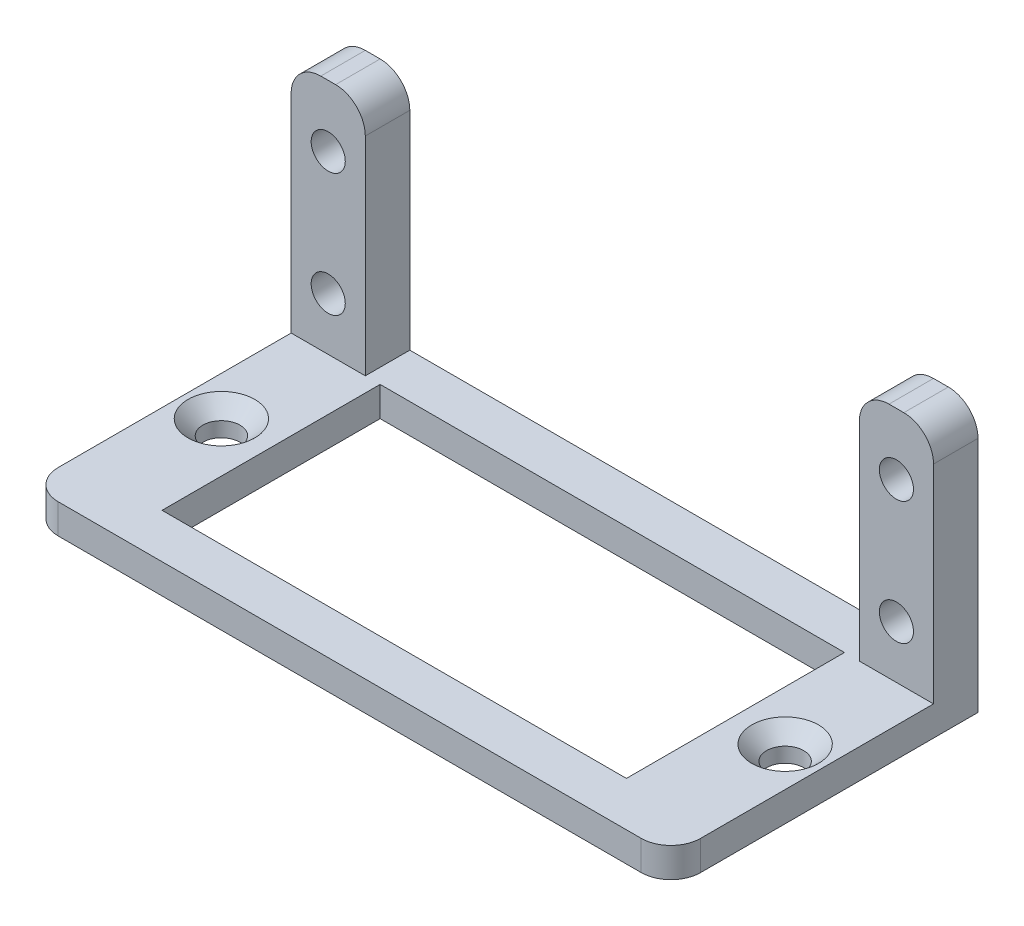
ISO-10303-21;
HEADER;
FILE_DESCRIPTION(('STEP AP214'),'2;1');
FILE_NAME('part.step','',(''),(''),'','','');
FILE_SCHEMA(('AUTOMOTIVE_DESIGN { 1 0 10303 214 1 1 1 1 }'));
ENDSEC;
DATA;
#1=APPLICATION_CONTEXT('core data for automotive mechanical design processes');
#2=APPLICATION_PROTOCOL_DEFINITION('international standard','automotive_design',2000,#1);
#3=PRODUCT_CONTEXT('',#1,'mechanical');
#4=PRODUCT('Part','Part','',(#3));
#5=PRODUCT_RELATED_PRODUCT_CATEGORY('part','',(#4));
#6=PRODUCT_DEFINITION_FORMATION('','',#4);
#7=PRODUCT_DEFINITION_CONTEXT('part definition',#1,'design');
#8=PRODUCT_DEFINITION('design','',#6,#7);
#9=PRODUCT_DEFINITION_SHAPE('','',#8);
#10=(LENGTH_UNIT() NAMED_UNIT(*) SI_UNIT(.MILLI.,.METRE.));
#11=(NAMED_UNIT(*) PLANE_ANGLE_UNIT() SI_UNIT($,.RADIAN.));
#12=(NAMED_UNIT(*) SI_UNIT($,.STERADIAN.) SOLID_ANGLE_UNIT());
#13=UNCERTAINTY_MEASURE_WITH_UNIT(LENGTH_MEASURE(1.E-05),#10,'distance_accuracy_value','');
#14=(GEOMETRIC_REPRESENTATION_CONTEXT(3) GLOBAL_UNCERTAINTY_ASSIGNED_CONTEXT((#13)) GLOBAL_UNIT_ASSIGNED_CONTEXT((#10,
#11,#12)) REPRESENTATION_CONTEXT('',''));
#15=CARTESIAN_POINT('',(0.,0.,0.));
#16=DIRECTION('',(0.,0.,1.));
#17=DIRECTION('',(1.,0.,0.));
#18=AXIS2_PLACEMENT_3D('',#15,#16,#17);
#19=CARTESIAN_POINT('',(7.62,2.54,-22.479));
#20=DIRECTION('',(0.,0.,1.));
#21=DIRECTION('',(1.,0.,0.));
#22=AXIS2_PLACEMENT_3D('',#19,#20,#21);
#23=PLANE('',#22);
#24=CARTESIAN_POINT('',(3.175,7.0485,-22.479));
#25=DIRECTION('',(0.,0.,1.));
#26=DIRECTION('',(1.,0.,0.));
#27=AXIS2_PLACEMENT_3D('',#24,#25,#26);
#28=CIRCLE('',#27,1.4605);
#29=CARTESIAN_POINT('',(4.6355,7.0485,-22.479));
#30=VERTEX_POINT('',#29);
#31=EDGE_CURVE('E849',#30,#30,#28,.T.);
#32=ORIENTED_EDGE('',*,*,#31,.F.);
#33=EDGE_LOOP('',(#32));
#34=FACE_BOUND('',#33,.T.);
#35=CARTESIAN_POINT('',(3.175,17.5895,-22.479));
#36=DIRECTION('',(0.,0.,1.));
#37=DIRECTION('',(1.,0.,0.));
#38=AXIS2_PLACEMENT_3D('',#35,#36,#37);
#39=CIRCLE('',#38,1.4605);
#40=CARTESIAN_POINT('',(4.6355,17.5895,-22.479));
#41=VERTEX_POINT('',#40);
#42=EDGE_CURVE('E851',#41,#41,#39,.T.);
#43=ORIENTED_EDGE('',*,*,#42,.F.);
#44=EDGE_LOOP('',(#43));
#45=FACE_BOUND('',#44,.T.);
#46=DIRECTION('',(0.,-1.,0.));
#47=VECTOR('',#46,1.);
#48=CARTESIAN_POINT('',(6.35,22.86,-22.479));
#49=LINE('',#48,#47);
#50=CARTESIAN_POINT('',(6.35,20.32,-22.479));
#51=VERTEX_POINT('',#50);
#52=CARTESIAN_POINT('',(6.35,2.54,-22.479));
#53=VERTEX_POINT('',#52);
#54=EDGE_CURVE('E204',#51,#53,#49,.T.);
#55=ORIENTED_EDGE('',*,*,#54,.F.);
#56=CARTESIAN_POINT('',(3.81,20.32,-22.479));
#57=DIRECTION('',(0.,0.,1.));
#58=DIRECTION('',(1.,0.,0.));
#59=AXIS2_PLACEMENT_3D('',#56,#57,#58);
#60=CIRCLE('',#59,2.54);
#61=CARTESIAN_POINT('',(3.81,22.86,-22.479));
#62=VERTEX_POINT('',#61);
#63=EDGE_CURVE('E61',#51,#62,#60,.T.);
#64=ORIENTED_EDGE('',*,*,#63,.T.);
#65=DIRECTION('',(1.,0.,0.));
#66=VECTOR('',#65,1.);
#67=CARTESIAN_POINT('',(0.,22.86,-22.479));
#68=LINE('',#67,#66);
#69=CARTESIAN_POINT('',(2.54,22.86,-22.479));
#70=VERTEX_POINT('',#69);
#71=EDGE_CURVE('E234',#70,#62,#68,.T.);
#72=ORIENTED_EDGE('',*,*,#71,.F.);
#73=CARTESIAN_POINT('',(2.54,20.32,-22.479));
#74=DIRECTION('',(0.,0.,1.));
#75=DIRECTION('',(1.,0.,0.));
#76=AXIS2_PLACEMENT_3D('',#73,#74,#75);
#77=CIRCLE('',#76,2.54);
#78=CARTESIAN_POINT('',(0.,20.32,-22.479));
#79=VERTEX_POINT('',#78);
#80=EDGE_CURVE('E69',#70,#79,#77,.T.);
#81=ORIENTED_EDGE('',*,*,#80,.T.);
#82=DIRECTION('',(0.,-1.,0.));
#83=VECTOR('',#82,1.);
#84=CARTESIAN_POINT('',(0.,22.86,-22.479));
#85=LINE('',#84,#83);
#86=CARTESIAN_POINT('',(0.,2.54,-22.479));
#87=VERTEX_POINT('',#86);
#88=EDGE_CURVE('E250',#79,#87,#85,.T.);
#89=ORIENTED_EDGE('',*,*,#88,.T.);
#90=DIRECTION('',(1.,0.,0.));
#91=VECTOR('',#90,1.);
#92=CARTESIAN_POINT('',(0.,2.54,-22.479));
#93=LINE('',#92,#91);
#94=EDGE_CURVE('E232',#87,#53,#93,.T.);
#95=ORIENTED_EDGE('',*,*,#94,.T.);
#96=EDGE_LOOP('',(#55,#64,#72,#81,#89,#95));
#97=FACE_BOUND('',#96,.T.);
#98=ADVANCED_FACE('F44',(#34,#45,#97),#23,.T.);
#99=CARTESIAN_POINT('',(51.816,17.5895,-22.479));
#100=DIRECTION('',(0.,0.,1.));
#101=DIRECTION('',(1.,0.,0.));
#102=AXIS2_PLACEMENT_3D('',#99,#100,#101);
#103=CIRCLE('',#102,1.4605);
#104=CARTESIAN_POINT('',(53.2765,17.5895,-22.479));
#105=VERTEX_POINT('',#104);
#106=EDGE_CURVE('E856',#105,#105,#103,.T.);
#107=ORIENTED_EDGE('',*,*,#106,.F.);
#108=EDGE_LOOP('',(#107));
#109=FACE_BOUND('',#108,.T.);
#110=CARTESIAN_POINT('',(51.816,7.0485,-22.479));
#111=DIRECTION('',(0.,0.,1.));
#112=DIRECTION('',(1.,0.,0.));
#113=AXIS2_PLACEMENT_3D('',#110,#111,#112);
#114=CIRCLE('',#113,1.4605);
#115=CARTESIAN_POINT('',(53.2765,7.0485,-22.479));
#116=VERTEX_POINT('',#115);
#117=EDGE_CURVE('E869',#116,#116,#114,.T.);
#118=ORIENTED_EDGE('',*,*,#117,.F.);
#119=EDGE_LOOP('',(#118));
#120=FACE_BOUND('',#119,.T.);
#121=DIRECTION('',(0.,-1.,0.));
#122=VECTOR('',#121,1.);
#123=CARTESIAN_POINT('',(54.991,22.86,-22.479));
#124=LINE('',#123,#122);
#125=CARTESIAN_POINT('',(54.991,20.32,-22.479));
#126=VERTEX_POINT('',#125);
#127=CARTESIAN_POINT('',(54.991,2.54,-22.479));
#128=VERTEX_POINT('',#127);
#129=EDGE_CURVE('E246',#126,#128,#124,.T.);
#130=ORIENTED_EDGE('',*,*,#129,.F.);
#131=CARTESIAN_POINT('',(52.451,20.32,-22.479));
#132=DIRECTION('',(0.,0.,1.));
#133=DIRECTION('',(1.,0.,0.));
#134=AXIS2_PLACEMENT_3D('',#131,#132,#133);
#135=CIRCLE('',#134,2.54);
#136=CARTESIAN_POINT('',(52.451,22.86,-22.479));
#137=VERTEX_POINT('',#136);
#138=EDGE_CURVE('E387',#126,#137,#135,.T.);
#139=ORIENTED_EDGE('',*,*,#138,.T.);
#140=CARTESIAN_POINT('',(51.181,22.86,-22.479));
#141=VERTEX_POINT('',#140);
#142=EDGE_CURVE('E238',#141,#137,#68,.T.);
#143=ORIENTED_EDGE('',*,*,#142,.F.);
#144=CARTESIAN_POINT('',(51.181,20.32,-22.479));
#145=DIRECTION('',(0.,0.,1.));
#146=DIRECTION('',(1.,0.,0.));
#147=AXIS2_PLACEMENT_3D('',#144,#145,#146);
#148=CIRCLE('',#147,2.54);
#149=CARTESIAN_POINT('',(48.641,20.32,-22.479));
#150=VERTEX_POINT('',#149);
#151=EDGE_CURVE('E384',#141,#150,#148,.T.);
#152=ORIENTED_EDGE('',*,*,#151,.T.);
#153=DIRECTION('',(0.,1.,0.));
#154=VECTOR('',#153,1.);
#155=CARTESIAN_POINT('',(48.641,22.86,-22.479));
#156=LINE('',#155,#154);
#157=CARTESIAN_POINT('',(48.641,2.54,-22.479));
#158=VERTEX_POINT('',#157);
#159=EDGE_CURVE('E199',#158,#150,#156,.T.);
#160=ORIENTED_EDGE('',*,*,#159,.F.);
#161=EDGE_CURVE('E245',#158,#128,#93,.T.);
#162=ORIENTED_EDGE('',*,*,#161,.T.);
#163=EDGE_LOOP('',(#130,#139,#143,#152,#160,#162));
#164=FACE_BOUND('',#163,.T.);
#165=ADVANCED_FACE('F450',(#109,#120,#164),#23,.T.);
#166=CARTESIAN_POINT('',(0.,22.86,0.));
#167=DIRECTION('',(0.,1.,0.));
#168=DIRECTION('',(0.,0.,1.));
#169=AXIS2_PLACEMENT_3D('',#166,#167,#168);
#170=PLANE('',#169);
#171=ORIENTED_EDGE('',*,*,#71,.T.);
#172=DIRECTION('',(0.,0.,1.));
#173=VECTOR('',#172,1.);
#174=CARTESIAN_POINT('',(3.81,22.86,-26.289));
#175=LINE('',#174,#173);
#176=CARTESIAN_POINT('',(3.81,22.86,-26.289));
#177=VERTEX_POINT('',#176);
#178=EDGE_CURVE('E403',#62,#177,#175,.F.);
#179=ORIENTED_EDGE('',*,*,#178,.T.);
#180=DIRECTION('',(-1.,0.,0.));
#181=VECTOR('',#180,1.);
#182=CARTESIAN_POINT('',(0.,22.86,-26.289));
#183=LINE('',#182,#181);
#184=CARTESIAN_POINT('',(2.54,22.86,-26.289));
#185=VERTEX_POINT('',#184);
#186=EDGE_CURVE('E237',#177,#185,#183,.T.);
#187=ORIENTED_EDGE('',*,*,#186,.T.);
#188=DIRECTION('',(0.,0.,1.));
#189=VECTOR('',#188,1.);
#190=CARTESIAN_POINT('',(2.54,22.86,-22.479));
#191=LINE('',#190,#189);
#192=EDGE_CURVE('E400',#185,#70,#191,.T.);
#193=ORIENTED_EDGE('',*,*,#192,.T.);
#194=EDGE_LOOP('',(#171,#179,#187,#193));
#195=FACE_BOUND('',#194,.T.);
#196=ADVANCED_FACE('F445',(#195),#170,.T.);
#197=CARTESIAN_POINT('',(0.,2.54,0.));
#198=DIRECTION('',(0.,-1.,0.));
#199=DIRECTION('',(0.,0.,-1.));
#200=AXIS2_PLACEMENT_3D('',#197,#198,#199);
#201=PLANE('',#200);
#202=CARTESIAN_POINT('',(3.3655,2.54,-13.1445));
#203=DIRECTION('',(0.,-1.,0.));
#204=DIRECTION('',(0.,0.,-1.));
#205=AXIS2_PLACEMENT_3D('',#202,#203,#204);
#206=CIRCLE('',#205,2.85750000000001);
#207=CARTESIAN_POINT('',(3.3655,2.54,-16.002));
#208=VERTEX_POINT('',#207);
#209=EDGE_CURVE('E54',#208,#208,#206,.T.);
#210=ORIENTED_EDGE('',*,*,#209,.T.);
#211=EDGE_LOOP('',(#210));
#212=FACE_BOUND('',#211,.T.);
#213=CARTESIAN_POINT('',(51.6255,2.54,-13.1445));
#214=DIRECTION('',(0.,-1.,0.));
#215=DIRECTION('',(0.,0.,-1.));
#216=AXIS2_PLACEMENT_3D('',#213,#214,#215);
#217=CIRCLE('',#216,2.85750000000001);
#218=CARTESIAN_POINT('',(51.6255,2.54,-16.002));
#219=VERTEX_POINT('',#218);
#220=EDGE_CURVE('E410',#219,#219,#217,.T.);
#221=ORIENTED_EDGE('',*,*,#220,.T.);
#222=EDGE_LOOP('',(#221));
#223=FACE_BOUND('',#222,.T.);
#224=DIRECTION('',(0.,0.,1.));
#225=VECTOR('',#224,1.);
#226=CARTESIAN_POINT('',(7.62,2.54,-22.479));
#227=LINE('',#226,#225);
#228=CARTESIAN_POINT('',(7.62,2.54,-22.479));
#229=VERTEX_POINT('',#228);
#230=CARTESIAN_POINT('',(7.62,2.54,-3.81));
#231=VERTEX_POINT('',#230);
#232=EDGE_CURVE('E262',#229,#231,#227,.T.);
#233=ORIENTED_EDGE('',*,*,#232,.F.);
#234=DIRECTION('',(1.,0.,0.));
#235=VECTOR('',#234,1.);
#236=CARTESIAN_POINT('',(6.35,2.54,-22.479));
#237=LINE('',#236,#235);
#238=CARTESIAN_POINT('',(47.371,2.54,-22.479));
#239=VERTEX_POINT('',#238);
#240=EDGE_CURVE('E224',#229,#239,#237,.T.);
#241=ORIENTED_EDGE('',*,*,#240,.T.);
#242=DIRECTION('',(0.,0.,-1.));
#243=VECTOR('',#242,1.);
#244=CARTESIAN_POINT('',(47.371,2.54,-22.479));
#245=LINE('',#244,#243);
#246=CARTESIAN_POINT('',(47.371,2.54,-3.81));
#247=VERTEX_POINT('',#246);
#248=EDGE_CURVE('E269',#247,#239,#245,.T.);
#249=ORIENTED_EDGE('',*,*,#248,.F.);
#250=DIRECTION('',(1.,0.,0.));
#251=VECTOR('',#250,1.);
#252=CARTESIAN_POINT('',(7.62,2.54,-3.81));
#253=LINE('',#252,#251);
#254=EDGE_CURVE('E265',#231,#247,#253,.T.);
#255=ORIENTED_EDGE('',*,*,#254,.F.);
#256=EDGE_LOOP('',(#233,#241,#249,#255));
#257=FACE_BOUND('',#256,.T.);
#258=DIRECTION('',(1.,0.,0.));
#259=VECTOR('',#258,1.);
#260=CARTESIAN_POINT('',(0.,2.54,0.));
#261=LINE('',#260,#259);
#262=CARTESIAN_POINT('',(2.54,2.54,0.));
#263=VERTEX_POINT('',#262);
#264=CARTESIAN_POINT('',(52.451,2.54,0.));
#265=VERTEX_POINT('',#264);
#266=EDGE_CURVE('E306',#263,#265,#261,.T.);
#267=ORIENTED_EDGE('',*,*,#266,.T.);
#268=CARTESIAN_POINT('',(52.451,2.54,-2.54));
#269=DIRECTION('',(0.,-1.,0.));
#270=DIRECTION('',(0.,0.,-1.));
#271=AXIS2_PLACEMENT_3D('',#268,#269,#270);
#272=CIRCLE('',#271,2.54);
#273=CARTESIAN_POINT('',(54.991,2.54,-2.54));
#274=VERTEX_POINT('',#273);
#275=EDGE_CURVE('E356',#265,#274,#272,.F.);
#276=ORIENTED_EDGE('',*,*,#275,.T.);
#277=DIRECTION('',(0.,0.,-1.));
#278=VECTOR('',#277,1.);
#279=CARTESIAN_POINT('',(54.991,2.54,0.));
#280=LINE('',#279,#278);
#281=EDGE_CURVE('E310',#274,#128,#280,.T.);
#282=ORIENTED_EDGE('',*,*,#281,.T.);
#283=ORIENTED_EDGE('',*,*,#161,.F.);
#284=DIRECTION('',(0.,0.,1.));
#285=VECTOR('',#284,1.);
#286=CARTESIAN_POINT('',(48.641,2.54,-26.289));
#287=LINE('',#286,#285);
#288=CARTESIAN_POINT('',(48.641,2.54,-26.289));
#289=VERTEX_POINT('',#288);
#290=EDGE_CURVE('E209',#289,#158,#287,.T.);
#291=ORIENTED_EDGE('',*,*,#290,.F.);
#292=DIRECTION('',(1.,0.,0.));
#293=VECTOR('',#292,1.);
#294=CARTESIAN_POINT('',(6.35,2.54,-26.289));
#295=LINE('',#294,#293);
#296=CARTESIAN_POINT('',(6.35,2.54,-26.289));
#297=VERTEX_POINT('',#296);
#298=EDGE_CURVE('E191',#297,#289,#295,.T.);
#299=ORIENTED_EDGE('',*,*,#298,.F.);
#300=DIRECTION('',(0.,0.,1.));
#301=VECTOR('',#300,1.);
#302=CARTESIAN_POINT('',(6.35,2.54,-26.289));
#303=LINE('',#302,#301);
#304=EDGE_CURVE('E202',#297,#53,#303,.T.);
#305=ORIENTED_EDGE('',*,*,#304,.T.);
#306=ORIENTED_EDGE('',*,*,#94,.F.);
#307=DIRECTION('',(0.,0.,1.));
#308=VECTOR('',#307,1.);
#309=CARTESIAN_POINT('',(0.,2.54,0.));
#310=LINE('',#309,#308);
#311=CARTESIAN_POINT('',(0.,2.54,-2.54));
#312=VERTEX_POINT('',#311);
#313=EDGE_CURVE('E302',#87,#312,#310,.T.);
#314=ORIENTED_EDGE('',*,*,#313,.T.);
#315=CARTESIAN_POINT('',(2.54,2.54,-2.54));
#316=DIRECTION('',(0.,-1.,0.));
#317=DIRECTION('',(0.,0.,-1.));
#318=AXIS2_PLACEMENT_3D('',#315,#316,#317);
#319=CIRCLE('',#318,2.54);
#320=EDGE_CURVE('E353',#312,#263,#319,.F.);
#321=ORIENTED_EDGE('',*,*,#320,.T.);
#322=EDGE_LOOP('',(#267,#276,#282,#283,#291,#299,#305,#306,#314,#321));
#323=FACE_BOUND('',#322,.T.);
#324=ADVANCED_FACE('F213',(#212,#223,#257,#323),#201,.F.);
#325=CARTESIAN_POINT('',(0.,0.,0.));
#326=DIRECTION('',(0.,-1.,0.));
#327=DIRECTION('',(0.,0.,-1.));
#328=AXIS2_PLACEMENT_3D('',#325,#326,#327);
#329=PLANE('',#328);
#330=CARTESIAN_POINT('',(51.6255,0.,-13.1445));
#331=DIRECTION('',(0.,1.,0.));
#332=DIRECTION('',(0.,0.,1.));
#333=AXIS2_PLACEMENT_3D('',#330,#331,#332);
#334=CIRCLE('',#333,1.5875);
#335=CARTESIAN_POINT('',(51.6255,0.,-11.557));
#336=VERTEX_POINT('',#335);
#337=EDGE_CURVE('E257',#336,#336,#334,.T.);
#338=ORIENTED_EDGE('',*,*,#337,.T.);
#339=EDGE_LOOP('',(#338));
#340=FACE_BOUND('',#339,.T.);
#341=DIRECTION('',(0.,0.,-1.));
#342=VECTOR('',#341,1.);
#343=CARTESIAN_POINT('',(54.991,0.,0.));
#344=LINE('',#343,#342);
#345=CARTESIAN_POINT('',(54.991,0.,-2.54));
#346=VERTEX_POINT('',#345);
#347=CARTESIAN_POINT('',(54.991,0.,-26.289));
#348=VERTEX_POINT('',#347);
#349=EDGE_CURVE('E321',#346,#348,#344,.T.);
#350=ORIENTED_EDGE('',*,*,#349,.F.);
#351=CARTESIAN_POINT('',(52.451,0.,-2.54));
#352=DIRECTION('',(0.,-1.,0.));
#353=DIRECTION('',(0.,0.,-1.));
#354=AXIS2_PLACEMENT_3D('',#351,#352,#353);
#355=CIRCLE('',#354,2.54);
#356=CARTESIAN_POINT('',(52.451,0.,0.));
#357=VERTEX_POINT('',#356);
#358=EDGE_CURVE('E343',#346,#357,#355,.T.);
#359=ORIENTED_EDGE('',*,*,#358,.T.);
#360=DIRECTION('',(1.,0.,0.));
#361=VECTOR('',#360,1.);
#362=CARTESIAN_POINT('',(0.,0.,0.));
#363=LINE('',#362,#361);
#364=CARTESIAN_POINT('',(2.54,0.,0.));
#365=VERTEX_POINT('',#364);
#366=EDGE_CURVE('E317',#365,#357,#363,.T.);
#367=ORIENTED_EDGE('',*,*,#366,.F.);
#368=CARTESIAN_POINT('',(2.54,0.,-2.54));
#369=DIRECTION('',(0.,-1.,0.));
#370=DIRECTION('',(0.,0.,-1.));
#371=AXIS2_PLACEMENT_3D('',#368,#369,#370);
#372=CIRCLE('',#371,2.54);
#373=CARTESIAN_POINT('',(0.,0.,-2.54));
#374=VERTEX_POINT('',#373);
#375=EDGE_CURVE('E340',#365,#374,#372,.T.);
#376=ORIENTED_EDGE('',*,*,#375,.T.);
#377=DIRECTION('',(0.,0.,1.));
#378=VECTOR('',#377,1.);
#379=CARTESIAN_POINT('',(0.,0.,0.));
#380=LINE('',#379,#378);
#381=CARTESIAN_POINT('',(0.,0.,-26.289));
#382=VERTEX_POINT('',#381);
#383=EDGE_CURVE('E301',#382,#374,#380,.T.);
#384=ORIENTED_EDGE('',*,*,#383,.F.);
#385=DIRECTION('',(-1.,0.,0.));
#386=VECTOR('',#385,1.);
#387=CARTESIAN_POINT('',(0.,0.,-26.289));
#388=LINE('',#387,#386);
#389=EDGE_CURVE('E307',#348,#382,#388,.T.);
#390=ORIENTED_EDGE('',*,*,#389,.F.);
#391=EDGE_LOOP('',(#350,#359,#367,#376,#384,#390));
#392=FACE_BOUND('',#391,.T.);
#393=DIRECTION('',(-1.,0.,0.));
#394=VECTOR('',#393,1.);
#395=CARTESIAN_POINT('',(7.62,0.,-22.479));
#396=LINE('',#395,#394);
#397=CARTESIAN_POINT('',(47.371,0.,-22.479));
#398=VERTEX_POINT('',#397);
#399=CARTESIAN_POINT('',(7.62,0.,-22.479));
#400=VERTEX_POINT('',#399);
#401=EDGE_CURVE('E266',#398,#400,#396,.T.);
#402=ORIENTED_EDGE('',*,*,#401,.T.);
#403=DIRECTION('',(0.,0.,1.));
#404=VECTOR('',#403,1.);
#405=CARTESIAN_POINT('',(7.62,0.,-22.479));
#406=LINE('',#405,#404);
#407=CARTESIAN_POINT('',(7.62,0.,-3.81));
#408=VERTEX_POINT('',#407);
#409=EDGE_CURVE('E261',#400,#408,#406,.T.);
#410=ORIENTED_EDGE('',*,*,#409,.T.);
#411=DIRECTION('',(1.,0.,0.));
#412=VECTOR('',#411,1.);
#413=CARTESIAN_POINT('',(7.62,0.,-3.81));
#414=LINE('',#413,#412);
#415=CARTESIAN_POINT('',(47.371,0.,-3.81));
#416=VERTEX_POINT('',#415);
#417=EDGE_CURVE('E277',#408,#416,#414,.T.);
#418=ORIENTED_EDGE('',*,*,#417,.T.);
#419=DIRECTION('',(0.,0.,-1.));
#420=VECTOR('',#419,1.);
#421=CARTESIAN_POINT('',(47.371,0.,-22.479));
#422=LINE('',#421,#420);
#423=EDGE_CURVE('E281',#416,#398,#422,.T.);
#424=ORIENTED_EDGE('',*,*,#423,.T.);
#425=EDGE_LOOP('',(#402,#410,#418,#424));
#426=FACE_BOUND('',#425,.T.);
#427=CARTESIAN_POINT('',(3.3655,0.,-13.1445));
#428=DIRECTION('',(0.,1.,0.));
#429=DIRECTION('',(0.,0.,1.));
#430=AXIS2_PLACEMENT_3D('',#427,#428,#429);
#431=CIRCLE('',#430,1.5875);
#432=CARTESIAN_POINT('',(3.3655,0.,-11.557));
#433=VERTEX_POINT('',#432);
#434=EDGE_CURVE('E253',#433,#433,#431,.T.);
#435=ORIENTED_EDGE('',*,*,#434,.T.);
#436=EDGE_LOOP('',(#435));
#437=FACE_BOUND('',#436,.T.);
#438=ADVANCED_FACE('F433',(#340,#392,#426,#437),#329,.T.);
#439=CARTESIAN_POINT('',(0.,2.54,0.));
#440=DIRECTION('',(1.,0.,0.));
#441=DIRECTION('',(0.,0.,-1.));
#442=AXIS2_PLACEMENT_3D('',#439,#440,#441);
#443=PLANE('',#442);
#444=ORIENTED_EDGE('',*,*,#383,.T.);
#445=DIRECTION('',(0.,-1.,0.));
#446=VECTOR('',#445,1.);
#447=CARTESIAN_POINT('',(0.,2.54,-2.54));
#448=LINE('',#447,#446);
#449=EDGE_CURVE('E362',#374,#312,#448,.F.);
#450=ORIENTED_EDGE('',*,*,#449,.T.);
#451=ORIENTED_EDGE('',*,*,#313,.F.);
#452=ORIENTED_EDGE('',*,*,#88,.F.);
#453=DIRECTION('',(0.,0.,1.));
#454=VECTOR('',#453,1.);
#455=CARTESIAN_POINT('',(0.,20.32,-26.289));
#456=LINE('',#455,#454);
#457=CARTESIAN_POINT('',(0.,20.32,-26.289));
#458=VERTEX_POINT('',#457);
#459=EDGE_CURVE('E359',#79,#458,#456,.F.);
#460=ORIENTED_EDGE('',*,*,#459,.T.);
#461=DIRECTION('',(0.,-1.,0.));
#462=VECTOR('',#461,1.);
#463=CARTESIAN_POINT('',(0.,2.54,-26.289));
#464=LINE('',#463,#462);
#465=EDGE_CURVE('E313',#458,#382,#464,.T.);
#466=ORIENTED_EDGE('',*,*,#465,.T.);
#467=EDGE_LOOP('',(#444,#450,#451,#452,#460,#466));
#468=FACE_BOUND('',#467,.T.);
#469=ADVANCED_FACE('F435',(#468),#443,.F.);
#470=CARTESIAN_POINT('',(0.,2.54,0.));
#471=DIRECTION('',(0.,0.,-1.));
#472=DIRECTION('',(-1.,0.,0.));
#473=AXIS2_PLACEMENT_3D('',#470,#471,#472);
#474=PLANE('',#473);
#475=ORIENTED_EDGE('',*,*,#366,.T.);
#476=DIRECTION('',(0.,-1.,0.));
#477=VECTOR('',#476,1.);
#478=CARTESIAN_POINT('',(52.451,2.54,0.));
#479=LINE('',#478,#477);
#480=EDGE_CURVE('E350',#357,#265,#479,.F.);
#481=ORIENTED_EDGE('',*,*,#480,.T.);
#482=ORIENTED_EDGE('',*,*,#266,.F.);
#483=DIRECTION('',(0.,-1.,0.));
#484=VECTOR('',#483,1.);
#485=CARTESIAN_POINT('',(2.54,2.54,0.));
#486=LINE('',#485,#484);
#487=EDGE_CURVE('E346',#263,#365,#486,.T.);
#488=ORIENTED_EDGE('',*,*,#487,.T.);
#489=EDGE_LOOP('',(#475,#481,#482,#488));
#490=FACE_BOUND('',#489,.T.);
#491=ADVANCED_FACE('F442',(#490),#474,.F.);
#492=CARTESIAN_POINT('',(54.991,2.54,0.));
#493=DIRECTION('',(-1.,0.,0.));
#494=DIRECTION('',(0.,0.,1.));
#495=AXIS2_PLACEMENT_3D('',#492,#493,#494);
#496=PLANE('',#495);
#497=ORIENTED_EDGE('',*,*,#281,.F.);
#498=DIRECTION('',(0.,-1.,0.));
#499=VECTOR('',#498,1.);
#500=CARTESIAN_POINT('',(54.991,2.54,-2.54));
#501=LINE('',#500,#499);
#502=EDGE_CURVE('E336',#274,#346,#501,.T.);
#503=ORIENTED_EDGE('',*,*,#502,.T.);
#504=ORIENTED_EDGE('',*,*,#349,.T.);
#505=DIRECTION('',(0.,-1.,0.));
#506=VECTOR('',#505,1.);
#507=CARTESIAN_POINT('',(54.991,2.54,-26.289));
#508=LINE('',#507,#506);
#509=CARTESIAN_POINT('',(54.991,20.32,-26.289));
#510=VERTEX_POINT('',#509);
#511=EDGE_CURVE('E330',#510,#348,#508,.T.);
#512=ORIENTED_EDGE('',*,*,#511,.F.);
#513=DIRECTION('',(0.,0.,-1.));
#514=VECTOR('',#513,1.);
#515=CARTESIAN_POINT('',(54.991,20.32,-22.479));
#516=LINE('',#515,#514);
#517=EDGE_CURVE('E333',#510,#126,#516,.F.);
#518=ORIENTED_EDGE('',*,*,#517,.T.);
#519=ORIENTED_EDGE('',*,*,#129,.T.);
#520=EDGE_LOOP('',(#497,#503,#504,#512,#518,#519));
#521=FACE_BOUND('',#520,.T.);
#522=ADVANCED_FACE('F497',(#521),#496,.F.);
#523=CARTESIAN_POINT('',(0.,2.54,-26.289));
#524=DIRECTION('',(0.,0.,1.));
#525=DIRECTION('',(1.,0.,0.));
#526=AXIS2_PLACEMENT_3D('',#523,#524,#525);
#527=PLANE('',#526);
#528=CARTESIAN_POINT('',(3.175,7.0485,-26.289));
#529=DIRECTION('',(0.,0.,1.));
#530=DIRECTION('',(1.,0.,0.));
#531=AXIS2_PLACEMENT_3D('',#528,#529,#530);
#532=CIRCLE('',#531,1.4605);
#533=CARTESIAN_POINT('',(4.6355,7.0485,-26.289));
#534=VERTEX_POINT('',#533);
#535=EDGE_CURVE('E847',#534,#534,#532,.T.);
#536=ORIENTED_EDGE('',*,*,#535,.T.);
#537=EDGE_LOOP('',(#536));
#538=FACE_BOUND('',#537,.T.);
#539=CARTESIAN_POINT('',(51.816,17.5895,-26.289));
#540=DIRECTION('',(0.,0.,1.));
#541=DIRECTION('',(1.,0.,0.));
#542=AXIS2_PLACEMENT_3D('',#539,#540,#541);
#543=CIRCLE('',#542,1.4605);
#544=CARTESIAN_POINT('',(53.2765,17.5895,-26.289));
#545=VERTEX_POINT('',#544);
#546=EDGE_CURVE('E865',#545,#545,#543,.T.);
#547=ORIENTED_EDGE('',*,*,#546,.T.);
#548=EDGE_LOOP('',(#547));
#549=FACE_BOUND('',#548,.T.);
#550=CARTESIAN_POINT('',(51.816,7.0485,-26.289));
#551=DIRECTION('',(0.,0.,1.));
#552=DIRECTION('',(1.,0.,0.));
#553=AXIS2_PLACEMENT_3D('',#550,#551,#552);
#554=CIRCLE('',#553,1.4605);
#555=CARTESIAN_POINT('',(53.2765,7.0485,-26.289));
#556=VERTEX_POINT('',#555);
#557=EDGE_CURVE('E859',#556,#556,#554,.T.);
#558=ORIENTED_EDGE('',*,*,#557,.T.);
#559=EDGE_LOOP('',(#558));
#560=FACE_BOUND('',#559,.T.);
#561=CARTESIAN_POINT('',(3.175,17.5895,-26.289));
#562=DIRECTION('',(0.,0.,1.));
#563=DIRECTION('',(1.,0.,0.));
#564=AXIS2_PLACEMENT_3D('',#561,#562,#563);
#565=CIRCLE('',#564,1.4605);
#566=CARTESIAN_POINT('',(4.6355,17.5895,-26.289));
#567=VERTEX_POINT('',#566);
#568=EDGE_CURVE('E225',#567,#567,#565,.T.);
#569=ORIENTED_EDGE('',*,*,#568,.T.);
#570=EDGE_LOOP('',(#569));
#571=FACE_BOUND('',#570,.T.);
#572=CARTESIAN_POINT('',(52.451,22.86,-26.289));
#573=VERTEX_POINT('',#572);
#574=CARTESIAN_POINT('',(51.181,22.86,-26.289));
#575=VERTEX_POINT('',#574);
#576=EDGE_CURVE('E242',#573,#575,#183,.T.);
#577=ORIENTED_EDGE('',*,*,#576,.F.);
#578=CARTESIAN_POINT('',(52.451,20.32,-26.289));
#579=DIRECTION('',(0.,0.,1.));
#580=DIRECTION('',(1.,0.,0.));
#581=AXIS2_PLACEMENT_3D('',#578,#579,#580);
#582=CIRCLE('',#581,2.54);
#583=EDGE_CURVE('E381',#573,#510,#582,.F.);
#584=ORIENTED_EDGE('',*,*,#583,.T.);
#585=ORIENTED_EDGE('',*,*,#511,.T.);
#586=ORIENTED_EDGE('',*,*,#389,.T.);
#587=ORIENTED_EDGE('',*,*,#465,.F.);
#588=CARTESIAN_POINT('',(2.54,20.32,-26.289));
#589=DIRECTION('',(0.,0.,1.));
#590=DIRECTION('',(1.,0.,0.));
#591=AXIS2_PLACEMENT_3D('',#588,#589,#590);
#592=CIRCLE('',#591,2.54);
#593=EDGE_CURVE('E373',#458,#185,#592,.F.);
#594=ORIENTED_EDGE('',*,*,#593,.T.);
#595=ORIENTED_EDGE('',*,*,#186,.F.);
#596=CARTESIAN_POINT('',(3.81,20.32,-26.289));
#597=DIRECTION('',(0.,0.,1.));
#598=DIRECTION('',(1.,0.,0.));
#599=AXIS2_PLACEMENT_3D('',#596,#597,#598);
#600=CIRCLE('',#599,2.54);
#601=CARTESIAN_POINT('',(6.35,20.32,-26.289));
#602=VERTEX_POINT('',#601);
#603=EDGE_CURVE('E194',#177,#602,#600,.F.);
#604=ORIENTED_EDGE('',*,*,#603,.T.);
#605=DIRECTION('',(0.,-1.,0.));
#606=VECTOR('',#605,1.);
#607=CARTESIAN_POINT('',(6.35,22.86,-26.289));
#608=LINE('',#607,#606);
#609=EDGE_CURVE('E185',#602,#297,#608,.T.);
#610=ORIENTED_EDGE('',*,*,#609,.T.);
#611=ORIENTED_EDGE('',*,*,#298,.T.);
#612=DIRECTION('',(0.,1.,0.));
#613=VECTOR('',#612,1.);
#614=CARTESIAN_POINT('',(48.641,22.86,-26.289));
#615=LINE('',#614,#613);
#616=CARTESIAN_POINT('',(48.641,20.32,-26.289));
#617=VERTEX_POINT('',#616);
#618=EDGE_CURVE('E210',#289,#617,#615,.T.);
#619=ORIENTED_EDGE('',*,*,#618,.T.);
#620=CARTESIAN_POINT('',(51.181,20.32,-26.289));
#621=DIRECTION('',(0.,0.,1.));
#622=DIRECTION('',(1.,0.,0.));
#623=AXIS2_PLACEMENT_3D('',#620,#621,#622);
#624=CIRCLE('',#623,2.54);
#625=EDGE_CURVE('E378',#617,#575,#624,.F.);
#626=ORIENTED_EDGE('',*,*,#625,.T.);
#627=EDGE_LOOP('',(#577,#584,#585,#586,#587,#594,#595,#604,#610,#611,#619,#626));
#628=FACE_BOUND('',#627,.T.);
#629=ADVANCED_FACE('F188',(#538,#549,#560,#571,#628),#527,.F.);
#630=CARTESIAN_POINT('',(7.62,2.54,-22.479));
#631=DIRECTION('',(1.,0.,0.));
#632=DIRECTION('',(0.,0.,-1.));
#633=AXIS2_PLACEMENT_3D('',#630,#631,#632);
#634=PLANE('',#633);
#635=ORIENTED_EDGE('',*,*,#409,.F.);
#636=DIRECTION('',(0.,-1.,0.));
#637=VECTOR('',#636,1.);
#638=CARTESIAN_POINT('',(7.62,2.54,-22.479));
#639=LINE('',#638,#637);
#640=EDGE_CURVE('E273',#229,#400,#639,.T.);
#641=ORIENTED_EDGE('',*,*,#640,.F.);
#642=ORIENTED_EDGE('',*,*,#232,.T.);
#643=DIRECTION('',(0.,-1.,0.));
#644=VECTOR('',#643,1.);
#645=CARTESIAN_POINT('',(7.62,2.54,-3.81));
#646=LINE('',#645,#644);
#647=EDGE_CURVE('E297',#231,#408,#646,.T.);
#648=ORIENTED_EDGE('',*,*,#647,.T.);
#649=EDGE_LOOP('',(#635,#641,#642,#648));
#650=FACE_BOUND('',#649,.T.);
#651=ADVANCED_FACE('F480',(#650),#634,.T.);
#652=CARTESIAN_POINT('',(7.62,2.54,-3.81));
#653=DIRECTION('',(0.,0.,-1.));
#654=DIRECTION('',(-1.,0.,0.));
#655=AXIS2_PLACEMENT_3D('',#652,#653,#654);
#656=PLANE('',#655);
#657=ORIENTED_EDGE('',*,*,#417,.F.);
#658=ORIENTED_EDGE('',*,*,#647,.F.);
#659=ORIENTED_EDGE('',*,*,#254,.T.);
#660=DIRECTION('',(0.,-1.,0.));
#661=VECTOR('',#660,1.);
#662=CARTESIAN_POINT('',(47.371,2.54,-3.81));
#663=LINE('',#662,#661);
#664=EDGE_CURVE('E294',#247,#416,#663,.T.);
#665=ORIENTED_EDGE('',*,*,#664,.T.);
#666=EDGE_LOOP('',(#657,#658,#659,#665));
#667=FACE_BOUND('',#666,.T.);
#668=ADVANCED_FACE('F471',(#667),#656,.T.);
#669=CARTESIAN_POINT('',(47.371,2.54,-22.479));
#670=DIRECTION('',(-1.,0.,0.));
#671=DIRECTION('',(0.,0.,1.));
#672=AXIS2_PLACEMENT_3D('',#669,#670,#671);
#673=PLANE('',#672);
#674=ORIENTED_EDGE('',*,*,#423,.F.);
#675=ORIENTED_EDGE('',*,*,#664,.F.);
#676=ORIENTED_EDGE('',*,*,#248,.T.);
#677=DIRECTION('',(0.,-1.,0.));
#678=VECTOR('',#677,1.);
#679=CARTESIAN_POINT('',(47.371,2.54,-22.479));
#680=LINE('',#679,#678);
#681=EDGE_CURVE('E291',#239,#398,#680,.T.);
#682=ORIENTED_EDGE('',*,*,#681,.T.);
#683=EDGE_LOOP('',(#674,#675,#676,#682));
#684=FACE_BOUND('',#683,.T.);
#685=ADVANCED_FACE('F464',(#684),#673,.T.);
#686=ORIENTED_EDGE('',*,*,#240,.F.);
#687=ORIENTED_EDGE('',*,*,#640,.T.);
#688=ORIENTED_EDGE('',*,*,#401,.F.);
#689=ORIENTED_EDGE('',*,*,#681,.F.);
#690=EDGE_LOOP('',(#686,#687,#688,#689));
#691=FACE_BOUND('',#690,.T.);
#692=ADVANCED_FACE('F453',(#691),#23,.T.);
#693=CARTESIAN_POINT('',(51.6255,2.54,-13.1445));
#694=DIRECTION('',(0.,-1.,0.));
#695=DIRECTION('',(0.,0.,-1.));
#696=AXIS2_PLACEMENT_3D('',#693,#694,#695);
#697=CYLINDRICAL_SURFACE('',#696,1.5875);
#698=CARTESIAN_POINT('',(51.6255,1.26999999999999,-13.1445));
#699=DIRECTION('',(0.,-1.,0.));
#700=DIRECTION('',(0.,0.,-1.));
#701=AXIS2_PLACEMENT_3D('',#698,#699,#700);
#702=CIRCLE('',#701,1.5875);
#703=CARTESIAN_POINT('',(51.6255,1.26999999999999,-14.732));
#704=VERTEX_POINT('',#703);
#705=EDGE_CURVE('E11',#704,#704,#702,.F.);
#706=ORIENTED_EDGE('',*,*,#705,.T.);
#707=EDGE_LOOP('',(#706));
#708=FACE_BOUND('',#707,.T.);
#709=ORIENTED_EDGE('',*,*,#337,.F.);
#710=EDGE_LOOP('',(#709));
#711=FACE_BOUND('',#710,.T.);
#712=ADVANCED_FACE('F429',(#708,#711),#697,.F.);
#713=CARTESIAN_POINT('',(3.3655,2.54,-13.1445));
#714=DIRECTION('',(0.,-1.,0.));
#715=DIRECTION('',(0.,0.,-1.));
#716=AXIS2_PLACEMENT_3D('',#713,#714,#715);
#717=CYLINDRICAL_SURFACE('',#716,1.5875);
#718=CARTESIAN_POINT('',(3.3655,1.26999999999999,-13.1445));
#719=DIRECTION('',(0.,-1.,0.));
#720=DIRECTION('',(0.,0.,-1.));
#721=AXIS2_PLACEMENT_3D('',#718,#719,#720);
#722=CIRCLE('',#721,1.5875);
#723=CARTESIAN_POINT('',(3.3655,1.26999999999999,-14.732));
#724=VERTEX_POINT('',#723);
#725=EDGE_CURVE('E406',#724,#724,#722,.F.);
#726=ORIENTED_EDGE('',*,*,#725,.T.);
#727=EDGE_LOOP('',(#726));
#728=FACE_BOUND('',#727,.T.);
#729=ORIENTED_EDGE('',*,*,#434,.F.);
#730=EDGE_LOOP('',(#729));
#731=FACE_BOUND('',#730,.T.);
#732=ADVANCED_FACE('F425',(#728,#731),#717,.F.);
#733=ORIENTED_EDGE('',*,*,#142,.T.);
#734=DIRECTION('',(0.,0.,-1.));
#735=VECTOR('',#734,1.);
#736=CARTESIAN_POINT('',(52.451,22.86,-26.289));
#737=LINE('',#736,#735);
#738=EDGE_CURVE('E369',#137,#573,#737,.T.);
#739=ORIENTED_EDGE('',*,*,#738,.T.);
#740=ORIENTED_EDGE('',*,*,#576,.T.);
#741=DIRECTION('',(0.,0.,1.));
#742=VECTOR('',#741,1.);
#743=CARTESIAN_POINT('',(51.181,22.86,-22.479));
#744=LINE('',#743,#742);
#745=EDGE_CURVE('E365',#575,#141,#744,.T.);
#746=ORIENTED_EDGE('',*,*,#745,.T.);
#747=EDGE_LOOP('',(#733,#739,#740,#746));
#748=FACE_BOUND('',#747,.T.);
#749=ADVANCED_FACE('F428',(#748),#170,.T.);
#750=CARTESIAN_POINT('',(6.35,22.86,-26.289));
#751=DIRECTION('',(-1.,0.,0.));
#752=DIRECTION('',(0.,-1.,0.));
#753=AXIS2_PLACEMENT_3D('',#750,#751,#752);
#754=PLANE('',#753);
#755=ORIENTED_EDGE('',*,*,#609,.F.);
#756=DIRECTION('',(0.,0.,1.));
#757=VECTOR('',#756,1.);
#758=CARTESIAN_POINT('',(6.35,20.32,-22.479));
#759=LINE('',#758,#757);
#760=EDGE_CURVE('E393',#602,#51,#759,.T.);
#761=ORIENTED_EDGE('',*,*,#760,.T.);
#762=ORIENTED_EDGE('',*,*,#54,.T.);
#763=ORIENTED_EDGE('',*,*,#304,.F.);
#764=EDGE_LOOP('',(#755,#761,#762,#763));
#765=FACE_BOUND('',#764,.T.);
#766=ADVANCED_FACE('F203',(#765),#754,.F.);
#767=CARTESIAN_POINT('',(48.641,22.86,-26.289));
#768=DIRECTION('',(1.,0.,0.));
#769=DIRECTION('',(0.,0.,-1.));
#770=AXIS2_PLACEMENT_3D('',#767,#768,#769);
#771=PLANE('',#770);
#772=ORIENTED_EDGE('',*,*,#159,.T.);
#773=DIRECTION('',(0.,0.,1.));
#774=VECTOR('',#773,1.);
#775=CARTESIAN_POINT('',(48.641,20.32,-26.289));
#776=LINE('',#775,#774);
#777=EDGE_CURVE('E390',#150,#617,#776,.F.);
#778=ORIENTED_EDGE('',*,*,#777,.T.);
#779=ORIENTED_EDGE('',*,*,#618,.F.);
#780=ORIENTED_EDGE('',*,*,#290,.T.);
#781=EDGE_LOOP('',(#772,#778,#779,#780));
#782=FACE_BOUND('',#781,.T.);
#783=ADVANCED_FACE('F514',(#782),#771,.F.);
#784=CARTESIAN_POINT('',(52.451,2.54,-2.54));
#785=DIRECTION('',(0.,-1.,0.));
#786=DIRECTION('',(0.,0.,-1.));
#787=AXIS2_PLACEMENT_3D('',#784,#785,#786);
#788=CYLINDRICAL_SURFACE('',#787,2.54);
#789=ORIENTED_EDGE('',*,*,#275,.F.);
#790=ORIENTED_EDGE('',*,*,#480,.F.);
#791=ORIENTED_EDGE('',*,*,#358,.F.);
#792=ORIENTED_EDGE('',*,*,#502,.F.);
#793=EDGE_LOOP('',(#789,#790,#791,#792));
#794=FACE_BOUND('',#793,.T.);
#795=ADVANCED_FACE('F510',(#794),#788,.T.);
#796=CARTESIAN_POINT('',(2.54,2.54,-2.54));
#797=DIRECTION('',(0.,-1.,0.));
#798=DIRECTION('',(0.,0.,-1.));
#799=AXIS2_PLACEMENT_3D('',#796,#797,#798);
#800=CYLINDRICAL_SURFACE('',#799,2.54);
#801=ORIENTED_EDGE('',*,*,#320,.F.);
#802=ORIENTED_EDGE('',*,*,#449,.F.);
#803=ORIENTED_EDGE('',*,*,#375,.F.);
#804=ORIENTED_EDGE('',*,*,#487,.F.);
#805=EDGE_LOOP('',(#801,#802,#803,#804));
#806=FACE_BOUND('',#805,.T.);
#807=ADVANCED_FACE('F513',(#806),#800,.T.);
#808=CARTESIAN_POINT('',(52.451,20.32,0.));
#809=DIRECTION('',(0.,0.,1.));
#810=DIRECTION('',(1.,0.,0.));
#811=AXIS2_PLACEMENT_3D('',#808,#809,#810);
#812=CYLINDRICAL_SURFACE('',#811,2.54);
#813=ORIENTED_EDGE('',*,*,#138,.F.);
#814=ORIENTED_EDGE('',*,*,#517,.F.);
#815=ORIENTED_EDGE('',*,*,#583,.F.);
#816=ORIENTED_EDGE('',*,*,#738,.F.);
#817=EDGE_LOOP('',(#813,#814,#815,#816));
#818=FACE_BOUND('',#817,.T.);
#819=ADVANCED_FACE('F518',(#818),#812,.T.);
#820=CARTESIAN_POINT('',(51.181,20.32,0.));
#821=DIRECTION('',(0.,0.,-1.));
#822=DIRECTION('',(-1.,0.,0.));
#823=AXIS2_PLACEMENT_3D('',#820,#821,#822);
#824=CYLINDRICAL_SURFACE('',#823,2.54);
#825=ORIENTED_EDGE('',*,*,#625,.F.);
#826=ORIENTED_EDGE('',*,*,#777,.F.);
#827=ORIENTED_EDGE('',*,*,#151,.F.);
#828=ORIENTED_EDGE('',*,*,#745,.F.);
#829=EDGE_LOOP('',(#825,#826,#827,#828));
#830=FACE_BOUND('',#829,.T.);
#831=ADVANCED_FACE('F522',(#830),#824,.T.);
#832=CARTESIAN_POINT('',(3.81,20.32,-26.289));
#833=DIRECTION('',(0.,0.,-1.));
#834=DIRECTION('',(-1.,0.,0.));
#835=AXIS2_PLACEMENT_3D('',#832,#833,#834);
#836=CYLINDRICAL_SURFACE('',#835,2.54);
#837=ORIENTED_EDGE('',*,*,#603,.F.);
#838=ORIENTED_EDGE('',*,*,#178,.F.);
#839=ORIENTED_EDGE('',*,*,#63,.F.);
#840=ORIENTED_EDGE('',*,*,#760,.F.);
#841=EDGE_LOOP('',(#837,#838,#839,#840));
#842=FACE_BOUND('',#841,.T.);
#843=ADVANCED_FACE('F526',(#842),#836,.T.);
#844=CARTESIAN_POINT('',(2.54,20.32,0.));
#845=DIRECTION('',(0.,0.,-1.));
#846=DIRECTION('',(-1.,0.,0.));
#847=AXIS2_PLACEMENT_3D('',#844,#845,#846);
#848=CYLINDRICAL_SURFACE('',#847,2.54);
#849=ORIENTED_EDGE('',*,*,#593,.F.);
#850=ORIENTED_EDGE('',*,*,#459,.F.);
#851=ORIENTED_EDGE('',*,*,#80,.F.);
#852=ORIENTED_EDGE('',*,*,#192,.F.);
#853=EDGE_LOOP('',(#849,#850,#851,#852));
#854=FACE_BOUND('',#853,.T.);
#855=ADVANCED_FACE('F422',(#854),#848,.T.);
#856=CARTESIAN_POINT('',(3.3655,1.26999999999999,-13.1445));
#857=DIRECTION('',(0.,1.,0.));
#858=DIRECTION('',(0.,0.,1.));
#859=AXIS2_PLACEMENT_3D('',#856,#857,#858);
#860=CONICAL_SURFACE('',#859,1.5875,0.785398163397448);
#861=ORIENTED_EDGE('',*,*,#209,.F.);
#862=EDGE_LOOP('',(#861));
#863=FACE_BOUND('',#862,.T.);
#864=ORIENTED_EDGE('',*,*,#725,.F.);
#865=EDGE_LOOP('',(#864));
#866=FACE_BOUND('',#865,.T.);
#867=ADVANCED_FACE('F419',(#863,#866),#860,.F.);
#868=CARTESIAN_POINT('',(51.6255,1.26999999999999,-13.1445));
#869=DIRECTION('',(0.,1.,0.));
#870=DIRECTION('',(0.,0.,1.));
#871=AXIS2_PLACEMENT_3D('',#868,#869,#870);
#872=CONICAL_SURFACE('',#871,1.5875,0.78539816339745);
#873=ORIENTED_EDGE('',*,*,#220,.F.);
#874=EDGE_LOOP('',(#873));
#875=FACE_BOUND('',#874,.T.);
#876=ORIENTED_EDGE('',*,*,#705,.F.);
#877=EDGE_LOOP('',(#876));
#878=FACE_BOUND('',#877,.T.);
#879=ADVANCED_FACE('F47',(#875,#878),#872,.F.);
#880=CARTESIAN_POINT('',(3.175,17.5895,-26.289));
#881=DIRECTION('',(0.,0.,1.));
#882=DIRECTION('',(1.,0.,0.));
#883=AXIS2_PLACEMENT_3D('',#880,#881,#882);
#884=CYLINDRICAL_SURFACE('',#883,1.4605);
#885=ORIENTED_EDGE('',*,*,#568,.F.);
#886=EDGE_LOOP('',(#885));
#887=FACE_BOUND('',#886,.T.);
#888=ORIENTED_EDGE('',*,*,#42,.T.);
#889=EDGE_LOOP('',(#888));
#890=FACE_BOUND('',#889,.T.);
#891=ADVANCED_FACE('F583',(#887,#890),#884,.F.);
#892=CARTESIAN_POINT('',(51.816,7.0485,-26.289));
#893=DIRECTION('',(0.,0.,1.));
#894=DIRECTION('',(1.,0.,0.));
#895=AXIS2_PLACEMENT_3D('',#892,#893,#894);
#896=CYLINDRICAL_SURFACE('',#895,1.4605);
#897=ORIENTED_EDGE('',*,*,#557,.F.);
#898=EDGE_LOOP('',(#897));
#899=FACE_BOUND('',#898,.T.);
#900=ORIENTED_EDGE('',*,*,#117,.T.);
#901=EDGE_LOOP('',(#900));
#902=FACE_BOUND('',#901,.T.);
#903=ADVANCED_FACE('F644',(#899,#902),#896,.F.);
#904=CARTESIAN_POINT('',(51.816,17.5895,-26.289));
#905=DIRECTION('',(0.,0.,1.));
#906=DIRECTION('',(1.,0.,0.));
#907=AXIS2_PLACEMENT_3D('',#904,#905,#906);
#908=CYLINDRICAL_SURFACE('',#907,1.4605);
#909=ORIENTED_EDGE('',*,*,#546,.F.);
#910=EDGE_LOOP('',(#909));
#911=FACE_BOUND('',#910,.T.);
#912=ORIENTED_EDGE('',*,*,#106,.T.);
#913=EDGE_LOOP('',(#912));
#914=FACE_BOUND('',#913,.T.);
#915=ADVANCED_FACE('F650',(#911,#914),#908,.F.);
#916=CARTESIAN_POINT('',(3.175,7.0485,-26.289));
#917=DIRECTION('',(0.,0.,1.));
#918=DIRECTION('',(1.,0.,0.));
#919=AXIS2_PLACEMENT_3D('',#916,#917,#918);
#920=CYLINDRICAL_SURFACE('',#919,1.4605);
#921=ORIENTED_EDGE('',*,*,#535,.F.);
#922=EDGE_LOOP('',(#921));
#923=FACE_BOUND('',#922,.T.);
#924=ORIENTED_EDGE('',*,*,#31,.T.);
#925=EDGE_LOOP('',(#924));
#926=FACE_BOUND('',#925,.T.);
#927=ADVANCED_FACE('F658',(#923,#926),#920,.F.);
#928=CLOSED_SHELL('',(#98,#165,#196,#324,#438,#469,#491,#522,#629,#651,#668,#685,#692,#712,#732,
#749,#766,#783,#795,#807,#819,#831,#843,#855,#867,#879,#891,#903,#915,#927));
#929=MANIFOLD_SOLID_BREP('B2',#928);
#930=ADVANCED_BREP_SHAPE_REPRESENTATION('',(#18,#929),#14);
#931=SHAPE_DEFINITION_REPRESENTATION(#9,#930);
ENDSEC;
END-ISO-10303-21;
